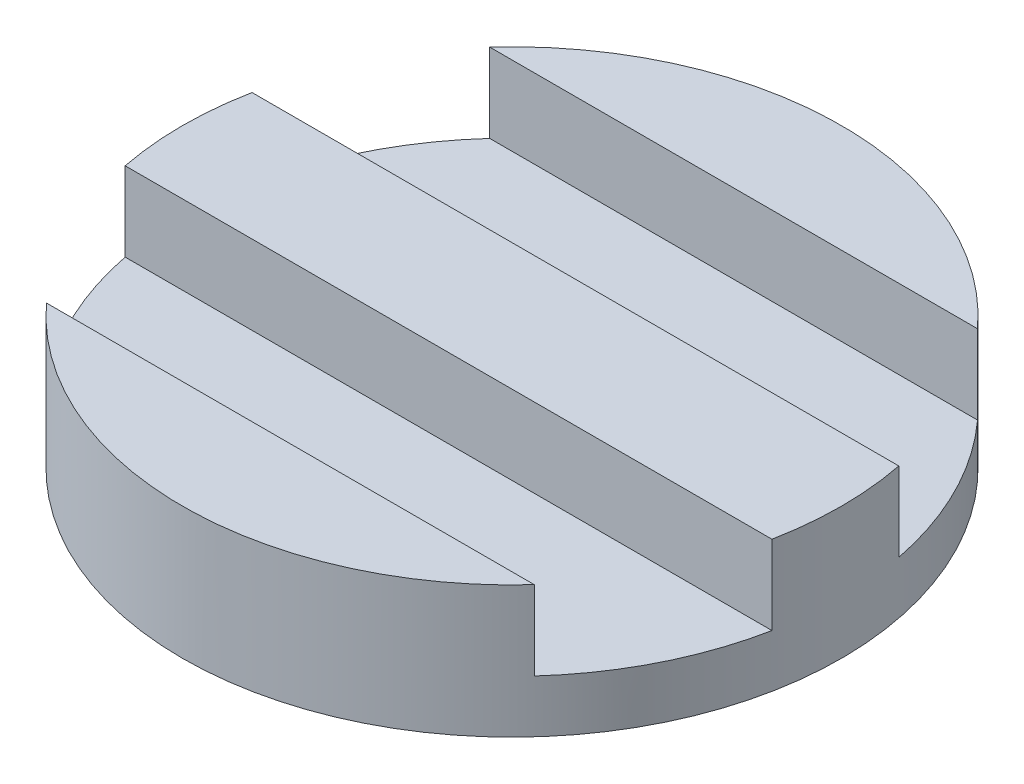
ISO-10303-21;
HEADER;
FILE_DESCRIPTION(('STEP AP214'),'2;1');
FILE_NAME('part.step','',(''),(''),'','','');
FILE_SCHEMA(('AUTOMOTIVE_DESIGN { 1 0 10303 214 1 1 1 1 }'));
ENDSEC;
DATA;
#1=APPLICATION_CONTEXT('core data for automotive mechanical design processes');
#2=APPLICATION_PROTOCOL_DEFINITION('international standard','automotive_design',2000,#1);
#3=PRODUCT_CONTEXT('',#1,'mechanical');
#4=PRODUCT('Part','Part','',(#3));
#5=PRODUCT_RELATED_PRODUCT_CATEGORY('part','',(#4));
#6=PRODUCT_DEFINITION_FORMATION('','',#4);
#7=PRODUCT_DEFINITION_CONTEXT('part definition',#1,'design');
#8=PRODUCT_DEFINITION('design','',#6,#7);
#9=PRODUCT_DEFINITION_SHAPE('','',#8);
#10=(LENGTH_UNIT() NAMED_UNIT(*) SI_UNIT(.MILLI.,.METRE.));
#11=(NAMED_UNIT(*) PLANE_ANGLE_UNIT() SI_UNIT($,.RADIAN.));
#12=(NAMED_UNIT(*) SI_UNIT($,.STERADIAN.) SOLID_ANGLE_UNIT());
#13=UNCERTAINTY_MEASURE_WITH_UNIT(LENGTH_MEASURE(1.E-05),#10,'distance_accuracy_value','');
#14=(GEOMETRIC_REPRESENTATION_CONTEXT(3) GLOBAL_UNCERTAINTY_ASSIGNED_CONTEXT((#13)) GLOBAL_UNIT_ASSIGNED_CONTEXT((#10,
#11,#12)) REPRESENTATION_CONTEXT('',''));
#15=CARTESIAN_POINT('',(0.,0.,0.));
#16=DIRECTION('',(0.,0.,1.));
#17=DIRECTION('',(1.,0.,0.));
#18=AXIS2_PLACEMENT_3D('',#15,#16,#17);
#19=CARTESIAN_POINT('',(0.,50.,0.));
#20=DIRECTION('',(0.,1.,0.));
#21=DIRECTION('',(0.,0.,1.));
#22=AXIS2_PLACEMENT_3D('',#19,#20,#21);
#23=PLANE('',#22);
#24=DIRECTION('',(-1.,0.,0.));
#25=VECTOR('',#24,1.);
#26=CARTESIAN_POINT('',(-92.5144118502625,50.,-84.06));
#27=LINE('',#26,#25);
#28=CARTESIAN_POINT('',(92.5144118502625,50.,-84.06));
#29=VERTEX_POINT('',#28);
#30=CARTESIAN_POINT('',(-92.5144118502625,50.,-84.06));
#31=VERTEX_POINT('',#30);
#32=EDGE_CURVE('E124',#29,#31,#27,.T.);
#33=ORIENTED_EDGE('',*,*,#32,.F.);
#34=CARTESIAN_POINT('',(0.,50.,0.));
#35=DIRECTION('',(0.,1.,0.));
#36=DIRECTION('',(0.,0.,1.));
#37=AXIS2_PLACEMENT_3D('',#34,#35,#36);
#38=CIRCLE('',#37,125.);
#39=EDGE_CURVE('E49',#29,#31,#38,.T.);
#40=ORIENTED_EDGE('',*,*,#39,.T.);
#41=EDGE_LOOP('',(#33,#40));
#42=FACE_BOUND('',#41,.T.);
#43=ADVANCED_FACE('F39',(#42),#23,.T.);
#44=DIRECTION('',(1.,0.,0.));
#45=VECTOR('',#44,1.);
#46=CARTESIAN_POINT('',(-122.662612070671,50.,-24.06));
#47=LINE('',#46,#45);
#48=CARTESIAN_POINT('',(-122.662612070671,50.,-24.06));
#49=VERTEX_POINT('',#48);
#50=CARTESIAN_POINT('',(122.662612070671,50.,-24.06));
#51=VERTEX_POINT('',#50);
#52=EDGE_CURVE('E165',#49,#51,#47,.T.);
#53=ORIENTED_EDGE('',*,*,#52,.F.);
#54=CARTESIAN_POINT('',(-122.662612070671,50.,24.06));
#55=VERTEX_POINT('',#54);
#56=EDGE_CURVE('E131',#49,#55,#38,.T.);
#57=ORIENTED_EDGE('',*,*,#56,.T.);
#58=DIRECTION('',(-1.,0.,0.));
#59=VECTOR('',#58,1.);
#60=CARTESIAN_POINT('',(-122.662612070671,50.,24.06));
#61=LINE('',#60,#59);
#62=CARTESIAN_POINT('',(122.662612070671,50.,24.06));
#63=VERTEX_POINT('',#62);
#64=EDGE_CURVE('E146',#63,#55,#61,.T.);
#65=ORIENTED_EDGE('',*,*,#64,.F.);
#66=EDGE_CURVE('E11',#63,#51,#38,.T.);
#67=ORIENTED_EDGE('',*,*,#66,.T.);
#68=EDGE_LOOP('',(#53,#57,#65,#67));
#69=FACE_BOUND('',#68,.T.);
#70=ADVANCED_FACE('F200',(#69),#23,.T.);
#71=CARTESIAN_POINT('',(0.,50.,0.));
#72=DIRECTION('',(0.,-1.,0.));
#73=DIRECTION('',(0.,0.,-1.));
#74=AXIS2_PLACEMENT_3D('',#71,#72,#73);
#75=CYLINDRICAL_SURFACE('',#74,125.);
#76=ORIENTED_EDGE('',*,*,#39,.F.);
#77=DIRECTION('',(0.,1.,0.));
#78=VECTOR('',#77,1.);
#79=CARTESIAN_POINT('',(92.5144118502625,20.,-84.06));
#80=LINE('',#79,#78);
#81=CARTESIAN_POINT('',(92.5144118502625,20.,-84.06));
#82=VERTEX_POINT('',#81);
#83=EDGE_CURVE('E136',#82,#29,#80,.T.);
#84=ORIENTED_EDGE('',*,*,#83,.F.);
#85=CARTESIAN_POINT('',(0.,20.,0.));
#86=DIRECTION('',(0.,1.,0.));
#87=DIRECTION('',(0.,0.,1.));
#88=AXIS2_PLACEMENT_3D('',#85,#86,#87);
#89=CIRCLE('',#88,125.);
#90=CARTESIAN_POINT('',(122.662612070671,20.,-24.06));
#91=VERTEX_POINT('',#90);
#92=EDGE_CURVE('E113',#91,#82,#89,.T.);
#93=ORIENTED_EDGE('',*,*,#92,.F.);
#94=DIRECTION('',(0.,1.,0.));
#95=VECTOR('',#94,1.);
#96=CARTESIAN_POINT('',(122.662612070671,20.,-24.06));
#97=LINE('',#96,#95);
#98=EDGE_CURVE('E109',#91,#51,#97,.T.);
#99=ORIENTED_EDGE('',*,*,#98,.T.);
#100=ORIENTED_EDGE('',*,*,#66,.F.);
#101=DIRECTION('',(0.,1.,0.));
#102=VECTOR('',#101,1.);
#103=CARTESIAN_POINT('',(122.662612070671,20.,24.06));
#104=LINE('',#103,#102);
#105=CARTESIAN_POINT('',(122.662612070671,20.,24.06));
#106=VERTEX_POINT('',#105);
#107=EDGE_CURVE('E166',#106,#63,#104,.T.);
#108=ORIENTED_EDGE('',*,*,#107,.F.);
#109=CARTESIAN_POINT('',(0.,20.,0.));
#110=DIRECTION('',(0.,1.,0.));
#111=DIRECTION('',(0.,0.,1.));
#112=AXIS2_PLACEMENT_3D('',#109,#110,#111);
#113=CIRCLE('',#112,125.);
#114=CARTESIAN_POINT('',(92.5144118502625,20.,84.06));
#115=VERTEX_POINT('',#114);
#116=EDGE_CURVE('E150',#115,#106,#113,.T.);
#117=ORIENTED_EDGE('',*,*,#116,.F.);
#118=DIRECTION('',(0.,1.,0.));
#119=VECTOR('',#118,1.);
#120=CARTESIAN_POINT('',(92.5144118502625,20.,84.06));
#121=LINE('',#120,#119);
#122=CARTESIAN_POINT('',(92.5144118502625,50.,84.06));
#123=VERTEX_POINT('',#122);
#124=EDGE_CURVE('E169',#115,#123,#121,.T.);
#125=ORIENTED_EDGE('',*,*,#124,.T.);
#126=CARTESIAN_POINT('',(-92.5144118502626,50.,84.06));
#127=VERTEX_POINT('',#126);
#128=EDGE_CURVE('E50',#127,#123,#38,.T.);
#129=ORIENTED_EDGE('',*,*,#128,.F.);
#130=DIRECTION('',(0.,1.,0.));
#131=VECTOR('',#130,1.);
#132=CARTESIAN_POINT('',(-92.5144118502625,20.,84.06));
#133=LINE('',#132,#131);
#134=CARTESIAN_POINT('',(-92.5144118502625,20.,84.06));
#135=VERTEX_POINT('',#134);
#136=EDGE_CURVE('E57',#135,#127,#133,.T.);
#137=ORIENTED_EDGE('',*,*,#136,.F.);
#138=CARTESIAN_POINT('',(0.,20.,0.));
#139=DIRECTION('',(0.,1.,0.));
#140=DIRECTION('',(0.,0.,1.));
#141=AXIS2_PLACEMENT_3D('',#138,#139,#140);
#142=CIRCLE('',#141,125.);
#143=CARTESIAN_POINT('',(-122.662612070671,20.,24.06));
#144=VERTEX_POINT('',#143);
#145=EDGE_CURVE('E141',#144,#135,#142,.T.);
#146=ORIENTED_EDGE('',*,*,#145,.F.);
#147=DIRECTION('',(0.,1.,0.));
#148=VECTOR('',#147,1.);
#149=CARTESIAN_POINT('',(-122.662612070671,20.,24.06));
#150=LINE('',#149,#148);
#151=EDGE_CURVE('E162',#144,#55,#150,.T.);
#152=ORIENTED_EDGE('',*,*,#151,.T.);
#153=ORIENTED_EDGE('',*,*,#56,.F.);
#154=DIRECTION('',(0.,1.,0.));
#155=VECTOR('',#154,1.);
#156=CARTESIAN_POINT('',(-122.662612070671,20.,-24.06));
#157=LINE('',#156,#155);
#158=CARTESIAN_POINT('',(-122.662612070671,20.,-24.06));
#159=VERTEX_POINT('',#158);
#160=EDGE_CURVE('E65',#159,#49,#157,.T.);
#161=ORIENTED_EDGE('',*,*,#160,.F.);
#162=CARTESIAN_POINT('',(0.,20.,0.));
#163=DIRECTION('',(0.,1.,0.));
#164=DIRECTION('',(0.,0.,1.));
#165=AXIS2_PLACEMENT_3D('',#162,#163,#164);
#166=CIRCLE('',#165,125.);
#167=CARTESIAN_POINT('',(-92.5144118502625,20.,-84.06));
#168=VERTEX_POINT('',#167);
#169=EDGE_CURVE('E114',#168,#159,#166,.T.);
#170=ORIENTED_EDGE('',*,*,#169,.F.);
#171=DIRECTION('',(0.,1.,0.));
#172=VECTOR('',#171,1.);
#173=CARTESIAN_POINT('',(-92.5144118502625,20.,-84.06));
#174=LINE('',#173,#172);
#175=EDGE_CURVE('E181',#168,#31,#174,.T.);
#176=ORIENTED_EDGE('',*,*,#175,.T.);
#177=EDGE_LOOP('',(#76,#84,#93,#99,#100,#108,#117,#125,#129,#137,#146,#152,#153,#161,#170,#176));
#178=FACE_BOUND('',#177,.T.);
#179=CARTESIAN_POINT('',(0.,0.,0.));
#180=DIRECTION('',(0.,1.,0.));
#181=DIRECTION('',(0.,0.,1.));
#182=AXIS2_PLACEMENT_3D('',#179,#180,#181);
#183=CIRCLE('',#182,125.);
#184=CARTESIAN_POINT('',(0.,0.,125.));
#185=VERTEX_POINT('',#184);
#186=EDGE_CURVE('E43',#185,#185,#183,.T.);
#187=ORIENTED_EDGE('',*,*,#186,.T.);
#188=EDGE_LOOP('',(#187));
#189=FACE_BOUND('',#188,.T.);
#190=ADVANCED_FACE('F41',(#178,#189),#75,.T.);
#191=DIRECTION('',(1.,0.,0.));
#192=VECTOR('',#191,1.);
#193=CARTESIAN_POINT('',(-92.5144118502625,50.,84.06));
#194=LINE('',#193,#192);
#195=EDGE_CURVE('E157',#127,#123,#194,.T.);
#196=ORIENTED_EDGE('',*,*,#195,.F.);
#197=ORIENTED_EDGE('',*,*,#128,.T.);
#198=EDGE_LOOP('',(#196,#197));
#199=FACE_BOUND('',#198,.T.);
#200=ADVANCED_FACE('F202',(#199),#23,.T.);
#201=CARTESIAN_POINT('',(0.,0.,0.));
#202=DIRECTION('',(0.,1.,0.));
#203=DIRECTION('',(0.,0.,1.));
#204=AXIS2_PLACEMENT_3D('',#201,#202,#203);
#205=PLANE('',#204);
#206=ORIENTED_EDGE('',*,*,#186,.F.);
#207=EDGE_LOOP('',(#206));
#208=FACE_BOUND('',#207,.T.);
#209=ADVANCED_FACE('F209',(#208),#205,.F.);
#210=CARTESIAN_POINT('',(-122.662612070671,20.,24.06));
#211=DIRECTION('',(0.,0.,-1.));
#212=DIRECTION('',(-1.,0.,0.));
#213=AXIS2_PLACEMENT_3D('',#210,#211,#212);
#214=PLANE('',#213);
#215=ORIENTED_EDGE('',*,*,#64,.T.);
#216=ORIENTED_EDGE('',*,*,#151,.F.);
#217=DIRECTION('',(-1.,0.,0.));
#218=VECTOR('',#217,1.);
#219=CARTESIAN_POINT('',(-122.662612070671,20.,24.06));
#220=LINE('',#219,#218);
#221=EDGE_CURVE('E153',#106,#144,#220,.T.);
#222=ORIENTED_EDGE('',*,*,#221,.F.);
#223=ORIENTED_EDGE('',*,*,#107,.T.);
#224=EDGE_LOOP('',(#215,#216,#222,#223));
#225=FACE_BOUND('',#224,.T.);
#226=ADVANCED_FACE('F214',(#225),#214,.F.);
#227=CARTESIAN_POINT('',(-92.5144118502625,20.,84.06));
#228=DIRECTION('',(0.,0.,1.));
#229=DIRECTION('',(1.,0.,0.));
#230=AXIS2_PLACEMENT_3D('',#227,#228,#229);
#231=PLANE('',#230);
#232=ORIENTED_EDGE('',*,*,#195,.T.);
#233=ORIENTED_EDGE('',*,*,#124,.F.);
#234=DIRECTION('',(1.,0.,0.));
#235=VECTOR('',#234,1.);
#236=CARTESIAN_POINT('',(-92.5144118502625,20.,84.06));
#237=LINE('',#236,#235);
#238=EDGE_CURVE('E145',#135,#115,#237,.T.);
#239=ORIENTED_EDGE('',*,*,#238,.F.);
#240=ORIENTED_EDGE('',*,*,#136,.T.);
#241=EDGE_LOOP('',(#232,#233,#239,#240));
#242=FACE_BOUND('',#241,.T.);
#243=ADVANCED_FACE('F219',(#242),#231,.F.);
#244=CARTESIAN_POINT('',(0.,20.,0.));
#245=DIRECTION('',(0.,1.,0.));
#246=DIRECTION('',(0.,0.,1.));
#247=AXIS2_PLACEMENT_3D('',#244,#245,#246);
#248=PLANE('',#247);
#249=ORIENTED_EDGE('',*,*,#145,.T.);
#250=ORIENTED_EDGE('',*,*,#238,.T.);
#251=ORIENTED_EDGE('',*,*,#116,.T.);
#252=ORIENTED_EDGE('',*,*,#221,.T.);
#253=EDGE_LOOP('',(#249,#250,#251,#252));
#254=FACE_BOUND('',#253,.T.);
#255=ADVANCED_FACE('F221',(#254),#248,.T.);
#256=CARTESIAN_POINT('',(-92.5144118502625,20.,-84.06));
#257=DIRECTION('',(0.,0.,-1.));
#258=DIRECTION('',(-1.,0.,0.));
#259=AXIS2_PLACEMENT_3D('',#256,#257,#258);
#260=PLANE('',#259);
#261=ORIENTED_EDGE('',*,*,#32,.T.);
#262=ORIENTED_EDGE('',*,*,#175,.F.);
#263=DIRECTION('',(-1.,0.,0.));
#264=VECTOR('',#263,1.);
#265=CARTESIAN_POINT('',(-92.5144118502625,20.,-84.06));
#266=LINE('',#265,#264);
#267=EDGE_CURVE('E120',#82,#168,#266,.T.);
#268=ORIENTED_EDGE('',*,*,#267,.F.);
#269=ORIENTED_EDGE('',*,*,#83,.T.);
#270=EDGE_LOOP('',(#261,#262,#268,#269));
#271=FACE_BOUND('',#270,.T.);
#272=ADVANCED_FACE('F195',(#271),#260,.F.);
#273=CARTESIAN_POINT('',(-122.662612070671,20.,-24.06));
#274=DIRECTION('',(0.,0.,1.));
#275=DIRECTION('',(1.,0.,0.));
#276=AXIS2_PLACEMENT_3D('',#273,#274,#275);
#277=PLANE('',#276);
#278=ORIENTED_EDGE('',*,*,#52,.T.);
#279=ORIENTED_EDGE('',*,*,#98,.F.);
#280=DIRECTION('',(1.,0.,0.));
#281=VECTOR('',#280,1.);
#282=CARTESIAN_POINT('',(-122.662612070671,20.,-24.06));
#283=LINE('',#282,#281);
#284=EDGE_CURVE('E105',#159,#91,#283,.T.);
#285=ORIENTED_EDGE('',*,*,#284,.F.);
#286=ORIENTED_EDGE('',*,*,#160,.T.);
#287=EDGE_LOOP('',(#278,#279,#285,#286));
#288=FACE_BOUND('',#287,.T.);
#289=ADVANCED_FACE('F107',(#288),#277,.F.);
#290=CARTESIAN_POINT('',(0.,20.,0.));
#291=DIRECTION('',(0.,1.,0.));
#292=DIRECTION('',(0.,0.,1.));
#293=AXIS2_PLACEMENT_3D('',#290,#291,#292);
#294=PLANE('',#293);
#295=ORIENTED_EDGE('',*,*,#169,.T.);
#296=ORIENTED_EDGE('',*,*,#284,.T.);
#297=ORIENTED_EDGE('',*,*,#92,.T.);
#298=ORIENTED_EDGE('',*,*,#267,.T.);
#299=EDGE_LOOP('',(#295,#296,#297,#298));
#300=FACE_BOUND('',#299,.T.);
#301=ADVANCED_FACE('F118',(#300),#294,.T.);
#302=CLOSED_SHELL('',(#43,#70,#190,#200,#209,#226,#243,#255,#272,#289,#301));
#303=MANIFOLD_SOLID_BREP('B2',#302);
#304=ADVANCED_BREP_SHAPE_REPRESENTATION('',(#18,#303),#14);
#305=SHAPE_DEFINITION_REPRESENTATION(#9,#304);
ENDSEC;
END-ISO-10303-21;
